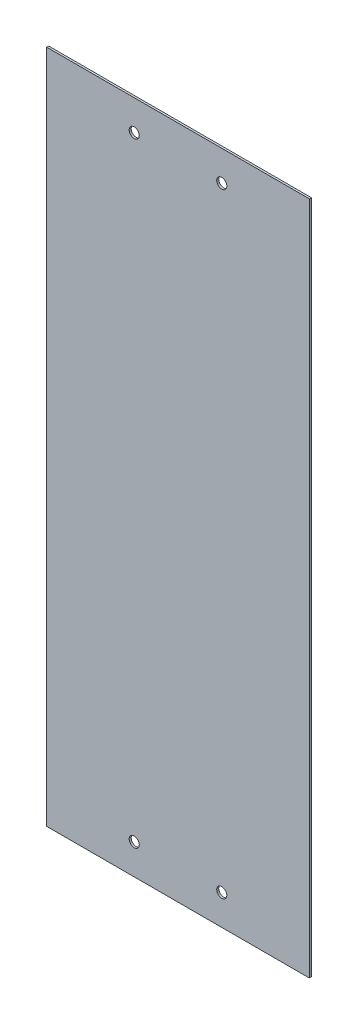
ISO-10303-21;
HEADER;
FILE_DESCRIPTION(('STEP AP214'),'2;1');
FILE_NAME('part.step','',(''),(''),'','','');
FILE_SCHEMA(('AUTOMOTIVE_DESIGN { 1 0 10303 214 1 1 1 1 }'));
ENDSEC;
DATA;
#1=APPLICATION_CONTEXT('core data for automotive mechanical design processes');
#2=APPLICATION_PROTOCOL_DEFINITION('international standard','automotive_design',2000,#1);
#3=PRODUCT_CONTEXT('',#1,'mechanical');
#4=PRODUCT('Part','Part','',(#3));
#5=PRODUCT_RELATED_PRODUCT_CATEGORY('part','',(#4));
#6=PRODUCT_DEFINITION_FORMATION('','',#4);
#7=PRODUCT_DEFINITION_CONTEXT('part definition',#1,'design');
#8=PRODUCT_DEFINITION('design','',#6,#7);
#9=PRODUCT_DEFINITION_SHAPE('','',#8);
#10=(LENGTH_UNIT() NAMED_UNIT(*) SI_UNIT(.MILLI.,.METRE.));
#11=(NAMED_UNIT(*) PLANE_ANGLE_UNIT() SI_UNIT($,.RADIAN.));
#12=(NAMED_UNIT(*) SI_UNIT($,.STERADIAN.) SOLID_ANGLE_UNIT());
#13=UNCERTAINTY_MEASURE_WITH_UNIT(LENGTH_MEASURE(1.E-05),#10,'distance_accuracy_value','');
#14=(GEOMETRIC_REPRESENTATION_CONTEXT(3) GLOBAL_UNCERTAINTY_ASSIGNED_CONTEXT((#13)) GLOBAL_UNIT_ASSIGNED_CONTEXT((#10,
#11,#12)) REPRESENTATION_CONTEXT('',''));
#15=CARTESIAN_POINT('',(0.,0.,0.));
#16=DIRECTION('',(0.,0.,1.));
#17=DIRECTION('',(1.,0.,0.));
#18=AXIS2_PLACEMENT_3D('',#15,#16,#17);
#19=CARTESIAN_POINT('',(-65.,0.,1.));
#20=DIRECTION('',(-1.,0.,0.));
#21=DIRECTION('',(0.,0.,1.));
#22=AXIS2_PLACEMENT_3D('',#19,#20,#21);
#23=PLANE('',#22);
#24=DIRECTION('',(0.,1.,0.));
#25=VECTOR('',#24,1.);
#26=CARTESIAN_POINT('',(-65.,0.,0.));
#27=LINE('',#26,#25);
#28=CARTESIAN_POINT('',(-65.,-167.,0.));
#29=VERTEX_POINT('',#28);
#30=CARTESIAN_POINT('',(-65.,167.,0.));
#31=VERTEX_POINT('',#30);
#32=EDGE_CURVE('E119',#29,#31,#27,.T.);
#33=ORIENTED_EDGE('',*,*,#32,.F.);
#34=DIRECTION('',(0.,0.,-1.));
#35=VECTOR('',#34,1.);
#36=CARTESIAN_POINT('',(-65.,-167.,1.));
#37=LINE('',#36,#35);
#38=CARTESIAN_POINT('',(-65.,-167.,1.));
#39=VERTEX_POINT('',#38);
#40=EDGE_CURVE('E11',#39,#29,#37,.T.);
#41=ORIENTED_EDGE('',*,*,#40,.F.);
#42=DIRECTION('',(0.,1.,0.));
#43=VECTOR('',#42,1.);
#44=CARTESIAN_POINT('',(-65.,0.,1.));
#45=LINE('',#44,#43);
#46=CARTESIAN_POINT('',(-65.,167.,1.));
#47=VERTEX_POINT('',#46);
#48=EDGE_CURVE('E100',#39,#47,#45,.T.);
#49=ORIENTED_EDGE('',*,*,#48,.T.);
#50=DIRECTION('',(0.,0.,-1.));
#51=VECTOR('',#50,1.);
#52=CARTESIAN_POINT('',(-65.,167.,1.));
#53=LINE('',#52,#51);
#54=EDGE_CURVE('E78',#47,#31,#53,.T.);
#55=ORIENTED_EDGE('',*,*,#54,.T.);
#56=EDGE_LOOP('',(#33,#41,#49,#55));
#57=FACE_BOUND('',#56,.T.);
#58=ADVANCED_FACE('F38',(#57),#23,.T.);
#59=CARTESIAN_POINT('',(0.,-167.,1.));
#60=DIRECTION('',(0.,-1.,0.));
#61=DIRECTION('',(0.,0.,-1.));
#62=AXIS2_PLACEMENT_3D('',#59,#60,#61);
#63=PLANE('',#62);
#64=DIRECTION('',(-1.,0.,0.));
#65=VECTOR('',#64,1.);
#66=CARTESIAN_POINT('',(0.,-167.,0.));
#67=LINE('',#66,#65);
#68=CARTESIAN_POINT('',(65.,-167.,0.));
#69=VERTEX_POINT('',#68);
#70=EDGE_CURVE('E90',#69,#29,#67,.T.);
#71=ORIENTED_EDGE('',*,*,#70,.F.);
#72=DIRECTION('',(0.,0.,-1.));
#73=VECTOR('',#72,1.);
#74=CARTESIAN_POINT('',(65.,-167.,1.));
#75=LINE('',#74,#73);
#76=CARTESIAN_POINT('',(65.,-167.,1.));
#77=VERTEX_POINT('',#76);
#78=EDGE_CURVE('E47',#77,#69,#75,.T.);
#79=ORIENTED_EDGE('',*,*,#78,.F.);
#80=DIRECTION('',(-1.,0.,0.));
#81=VECTOR('',#80,1.);
#82=CARTESIAN_POINT('',(0.,-167.,1.));
#83=LINE('',#82,#81);
#84=EDGE_CURVE('E88',#77,#39,#83,.T.);
#85=ORIENTED_EDGE('',*,*,#84,.T.);
#86=ORIENTED_EDGE('',*,*,#40,.T.);
#87=EDGE_LOOP('',(#71,#79,#85,#86));
#88=FACE_BOUND('',#87,.T.);
#89=ADVANCED_FACE('F86',(#88),#63,.T.);
#90=CARTESIAN_POINT('',(65.,0.,1.));
#91=DIRECTION('',(-1.,0.,0.));
#92=DIRECTION('',(0.,0.,1.));
#93=AXIS2_PLACEMENT_3D('',#90,#91,#92);
#94=PLANE('',#93);
#95=DIRECTION('',(0.,1.,0.));
#96=VECTOR('',#95,1.);
#97=CARTESIAN_POINT('',(65.,0.,0.));
#98=LINE('',#97,#96);
#99=CARTESIAN_POINT('',(65.,167.,0.));
#100=VERTEX_POINT('',#99);
#101=EDGE_CURVE('E122',#69,#100,#98,.T.);
#102=ORIENTED_EDGE('',*,*,#101,.T.);
#103=DIRECTION('',(0.,0.,-1.));
#104=VECTOR('',#103,1.);
#105=CARTESIAN_POINT('',(65.,167.,1.));
#106=LINE('',#105,#104);
#107=CARTESIAN_POINT('',(65.,167.,1.));
#108=VERTEX_POINT('',#107);
#109=EDGE_CURVE('E93',#108,#100,#106,.T.);
#110=ORIENTED_EDGE('',*,*,#109,.F.);
#111=DIRECTION('',(0.,1.,0.));
#112=VECTOR('',#111,1.);
#113=CARTESIAN_POINT('',(65.,0.,1.));
#114=LINE('',#113,#112);
#115=EDGE_CURVE('E95',#77,#108,#114,.T.);
#116=ORIENTED_EDGE('',*,*,#115,.F.);
#117=ORIENTED_EDGE('',*,*,#78,.T.);
#118=EDGE_LOOP('',(#102,#110,#116,#117));
#119=FACE_BOUND('',#118,.T.);
#120=ADVANCED_FACE('F96',(#119),#94,.F.);
#121=CARTESIAN_POINT('',(0.,167.,1.));
#122=DIRECTION('',(0.,-1.,0.));
#123=DIRECTION('',(0.,0.,-1.));
#124=AXIS2_PLACEMENT_3D('',#121,#122,#123);
#125=PLANE('',#124);
#126=DIRECTION('',(-1.,0.,0.));
#127=VECTOR('',#126,1.);
#128=CARTESIAN_POINT('',(0.,167.,0.));
#129=LINE('',#128,#127);
#130=EDGE_CURVE('E71',#100,#31,#129,.T.);
#131=ORIENTED_EDGE('',*,*,#130,.T.);
#132=ORIENTED_EDGE('',*,*,#54,.F.);
#133=DIRECTION('',(-1.,0.,0.));
#134=VECTOR('',#133,1.);
#135=CARTESIAN_POINT('',(0.,167.,1.));
#136=LINE('',#135,#134);
#137=EDGE_CURVE('E55',#108,#47,#136,.T.);
#138=ORIENTED_EDGE('',*,*,#137,.F.);
#139=ORIENTED_EDGE('',*,*,#109,.T.);
#140=EDGE_LOOP('',(#131,#132,#138,#139));
#141=FACE_BOUND('',#140,.T.);
#142=ADVANCED_FACE('F131',(#141),#125,.F.);
#143=CARTESIAN_POINT('',(-21.6666666666667,152.,1.));
#144=DIRECTION('',(0.,0.,-1.));
#145=DIRECTION('',(-1.,0.,0.));
#146=AXIS2_PLACEMENT_3D('',#143,#144,#145);
#147=CYLINDRICAL_SURFACE('',#146,2.5);
#148=CARTESIAN_POINT('',(-21.6666666666667,152.,1.));
#149=DIRECTION('',(0.,0.,1.));
#150=DIRECTION('',(1.,0.,0.));
#151=AXIS2_PLACEMENT_3D('',#148,#149,#150);
#152=CIRCLE('',#151,2.5);
#153=CARTESIAN_POINT('',(-19.1666666666667,152.,1.));
#154=VERTEX_POINT('',#153);
#155=EDGE_CURVE('E102',#154,#154,#152,.T.);
#156=ORIENTED_EDGE('',*,*,#155,.T.);
#157=EDGE_LOOP('',(#156));
#158=FACE_BOUND('',#157,.T.);
#159=CARTESIAN_POINT('',(-21.6666666666667,152.,0.));
#160=DIRECTION('',(0.,0.,1.));
#161=DIRECTION('',(1.,0.,0.));
#162=AXIS2_PLACEMENT_3D('',#159,#160,#161);
#163=CIRCLE('',#162,2.5);
#164=CARTESIAN_POINT('',(-19.1666666666667,152.,0.));
#165=VERTEX_POINT('',#164);
#166=EDGE_CURVE('E116',#165,#165,#163,.T.);
#167=ORIENTED_EDGE('',*,*,#166,.F.);
#168=EDGE_LOOP('',(#167));
#169=FACE_BOUND('',#168,.T.);
#170=ADVANCED_FACE('F142',(#158,#169),#147,.F.);
#171=CARTESIAN_POINT('',(21.6666666666667,152.,1.));
#172=DIRECTION('',(0.,0.,-1.));
#173=DIRECTION('',(-1.,0.,0.));
#174=AXIS2_PLACEMENT_3D('',#171,#172,#173);
#175=CYLINDRICAL_SURFACE('',#174,2.5);
#176=CARTESIAN_POINT('',(21.6666666666667,152.,1.));
#177=DIRECTION('',(0.,0.,1.));
#178=DIRECTION('',(1.,0.,0.));
#179=AXIS2_PLACEMENT_3D('',#176,#177,#178);
#180=CIRCLE('',#179,2.5);
#181=CARTESIAN_POINT('',(24.1666666666667,152.,1.));
#182=VERTEX_POINT('',#181);
#183=EDGE_CURVE('E156',#182,#182,#180,.T.);
#184=ORIENTED_EDGE('',*,*,#183,.T.);
#185=EDGE_LOOP('',(#184));
#186=FACE_BOUND('',#185,.T.);
#187=CARTESIAN_POINT('',(21.6666666666667,152.,0.));
#188=DIRECTION('',(0.,0.,1.));
#189=DIRECTION('',(1.,0.,0.));
#190=AXIS2_PLACEMENT_3D('',#187,#188,#189);
#191=CIRCLE('',#190,2.5);
#192=CARTESIAN_POINT('',(24.1666666666667,152.,0.));
#193=VERTEX_POINT('',#192);
#194=EDGE_CURVE('E113',#193,#193,#191,.T.);
#195=ORIENTED_EDGE('',*,*,#194,.F.);
#196=EDGE_LOOP('',(#195));
#197=FACE_BOUND('',#196,.T.);
#198=ADVANCED_FACE('F144',(#186,#197),#175,.F.);
#199=CARTESIAN_POINT('',(21.6666666666667,-152.,1.));
#200=DIRECTION('',(0.,0.,-1.));
#201=DIRECTION('',(-1.,0.,0.));
#202=AXIS2_PLACEMENT_3D('',#199,#200,#201);
#203=CYLINDRICAL_SURFACE('',#202,2.5);
#204=CARTESIAN_POINT('',(21.6666666666667,-152.,1.));
#205=DIRECTION('',(0.,0.,1.));
#206=DIRECTION('',(1.,0.,0.));
#207=AXIS2_PLACEMENT_3D('',#204,#205,#206);
#208=CIRCLE('',#207,2.5);
#209=CARTESIAN_POINT('',(24.1666666666667,-152.,1.));
#210=VERTEX_POINT('',#209);
#211=EDGE_CURVE('E128',#210,#210,#208,.F.);
#212=ORIENTED_EDGE('',*,*,#211,.F.);
#213=EDGE_LOOP('',(#212));
#214=FACE_BOUND('',#213,.T.);
#215=CARTESIAN_POINT('',(21.6666666666667,-152.,0.));
#216=DIRECTION('',(0.,0.,1.));
#217=DIRECTION('',(1.,0.,0.));
#218=AXIS2_PLACEMENT_3D('',#215,#216,#217);
#219=CIRCLE('',#218,2.5);
#220=CARTESIAN_POINT('',(24.1666666666667,-152.,0.));
#221=VERTEX_POINT('',#220);
#222=EDGE_CURVE('E110',#221,#221,#219,.F.);
#223=ORIENTED_EDGE('',*,*,#222,.T.);
#224=EDGE_LOOP('',(#223));
#225=FACE_BOUND('',#224,.T.);
#226=ADVANCED_FACE('F40',(#214,#225),#203,.F.);
#227=CARTESIAN_POINT('',(-21.6666666666667,-152.,1.));
#228=DIRECTION('',(0.,0.,-1.));
#229=DIRECTION('',(-1.,0.,0.));
#230=AXIS2_PLACEMENT_3D('',#227,#228,#229);
#231=CYLINDRICAL_SURFACE('',#230,2.5);
#232=CARTESIAN_POINT('',(-21.6666666666667,-152.,1.));
#233=DIRECTION('',(0.,0.,1.));
#234=DIRECTION('',(1.,0.,0.));
#235=AXIS2_PLACEMENT_3D('',#232,#233,#234);
#236=CIRCLE('',#235,2.5);
#237=CARTESIAN_POINT('',(-19.1666666666667,-152.,1.));
#238=VERTEX_POINT('',#237);
#239=EDGE_CURVE('E107',#238,#238,#236,.F.);
#240=ORIENTED_EDGE('',*,*,#239,.F.);
#241=EDGE_LOOP('',(#240));
#242=FACE_BOUND('',#241,.T.);
#243=CARTESIAN_POINT('',(-21.6666666666667,-152.,0.));
#244=DIRECTION('',(0.,0.,1.));
#245=DIRECTION('',(1.,0.,0.));
#246=AXIS2_PLACEMENT_3D('',#243,#244,#245);
#247=CIRCLE('',#246,2.5);
#248=CARTESIAN_POINT('',(-19.1666666666667,-152.,0.));
#249=VERTEX_POINT('',#248);
#250=EDGE_CURVE('E125',#249,#249,#247,.F.);
#251=ORIENTED_EDGE('',*,*,#250,.T.);
#252=EDGE_LOOP('',(#251));
#253=FACE_BOUND('',#252,.T.);
#254=ADVANCED_FACE('F151',(#242,#253),#231,.F.);
#255=CARTESIAN_POINT('',(0.,0.,1.));
#256=DIRECTION('',(0.,0.,1.));
#257=DIRECTION('',(1.,0.,0.));
#258=AXIS2_PLACEMENT_3D('',#255,#256,#257);
#259=PLANE('',#258);
#260=ORIENTED_EDGE('',*,*,#211,.T.);
#261=EDGE_LOOP('',(#260));
#262=FACE_BOUND('',#261,.T.);
#263=ORIENTED_EDGE('',*,*,#183,.F.);
#264=EDGE_LOOP('',(#263));
#265=FACE_BOUND('',#264,.T.);
#266=ORIENTED_EDGE('',*,*,#155,.F.);
#267=EDGE_LOOP('',(#266));
#268=FACE_BOUND('',#267,.T.);
#269=ORIENTED_EDGE('',*,*,#48,.F.);
#270=ORIENTED_EDGE('',*,*,#84,.F.);
#271=ORIENTED_EDGE('',*,*,#115,.T.);
#272=ORIENTED_EDGE('',*,*,#137,.T.);
#273=EDGE_LOOP('',(#269,#270,#271,#272));
#274=FACE_BOUND('',#273,.T.);
#275=ORIENTED_EDGE('',*,*,#239,.T.);
#276=EDGE_LOOP('',(#275));
#277=FACE_BOUND('',#276,.T.);
#278=ADVANCED_FACE('F98',(#262,#265,#268,#274,#277),#259,.T.);
#279=CARTESIAN_POINT('',(0.,0.,0.));
#280=DIRECTION('',(0.,0.,1.));
#281=DIRECTION('',(1.,0.,0.));
#282=AXIS2_PLACEMENT_3D('',#279,#280,#281);
#283=PLANE('',#282);
#284=ORIENTED_EDGE('',*,*,#222,.F.);
#285=EDGE_LOOP('',(#284));
#286=FACE_BOUND('',#285,.T.);
#287=ORIENTED_EDGE('',*,*,#194,.T.);
#288=EDGE_LOOP('',(#287));
#289=FACE_BOUND('',#288,.T.);
#290=ORIENTED_EDGE('',*,*,#166,.T.);
#291=EDGE_LOOP('',(#290));
#292=FACE_BOUND('',#291,.T.);
#293=ORIENTED_EDGE('',*,*,#32,.T.);
#294=ORIENTED_EDGE('',*,*,#130,.F.);
#295=ORIENTED_EDGE('',*,*,#101,.F.);
#296=ORIENTED_EDGE('',*,*,#70,.T.);
#297=EDGE_LOOP('',(#293,#294,#295,#296));
#298=FACE_BOUND('',#297,.T.);
#299=ORIENTED_EDGE('',*,*,#250,.F.);
#300=EDGE_LOOP('',(#299));
#301=FACE_BOUND('',#300,.T.);
#302=ADVANCED_FACE('F132',(#286,#289,#292,#298,#301),#283,.F.);
#303=CLOSED_SHELL('',(#58,#89,#120,#142,#170,#198,#226,#254,#278,#302));
#304=MANIFOLD_SOLID_BREP('B2',#303);
#305=ADVANCED_BREP_SHAPE_REPRESENTATION('',(#18,#304),#14);
#306=SHAPE_DEFINITION_REPRESENTATION(#9,#305);
ENDSEC;
END-ISO-10303-21;
